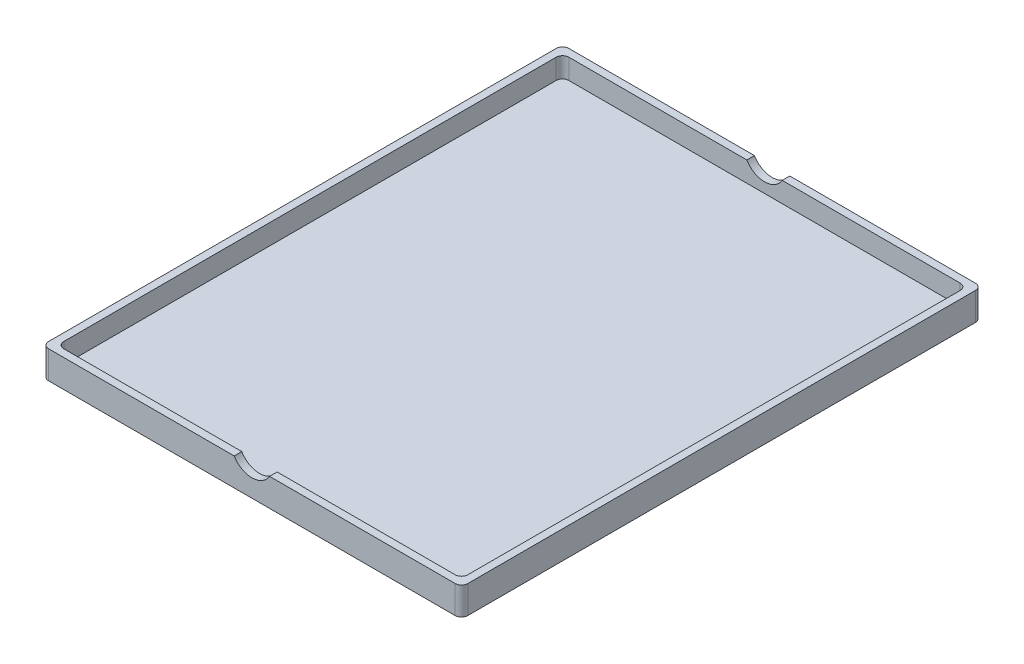
ISO-10303-21;
HEADER;
FILE_DESCRIPTION(('STEP AP214'),'2;1');
FILE_NAME('part.step','',(''),(''),'','','');
FILE_SCHEMA(('AUTOMOTIVE_DESIGN { 1 0 10303 214 1 1 1 1 }'));
ENDSEC;
DATA;
#1=APPLICATION_CONTEXT('core data for automotive mechanical design processes');
#2=APPLICATION_PROTOCOL_DEFINITION('international standard','automotive_design',2000,#1);
#3=PRODUCT_CONTEXT('',#1,'mechanical');
#4=PRODUCT('Part','Part','',(#3));
#5=PRODUCT_RELATED_PRODUCT_CATEGORY('part','',(#4));
#6=PRODUCT_DEFINITION_FORMATION('','',#4);
#7=PRODUCT_DEFINITION_CONTEXT('part definition',#1,'design');
#8=PRODUCT_DEFINITION('design','',#6,#7);
#9=PRODUCT_DEFINITION_SHAPE('','',#8);
#10=(LENGTH_UNIT() NAMED_UNIT(*) SI_UNIT(.MILLI.,.METRE.));
#11=(NAMED_UNIT(*) PLANE_ANGLE_UNIT() SI_UNIT($,.RADIAN.));
#12=(NAMED_UNIT(*) SI_UNIT($,.STERADIAN.) SOLID_ANGLE_UNIT());
#13=UNCERTAINTY_MEASURE_WITH_UNIT(LENGTH_MEASURE(1.E-05),#10,'distance_accuracy_value','');
#14=(GEOMETRIC_REPRESENTATION_CONTEXT(3) GLOBAL_UNCERTAINTY_ASSIGNED_CONTEXT((#13)) GLOBAL_UNIT_ASSIGNED_CONTEXT((#10,
#11,#12)) REPRESENTATION_CONTEXT('',''));
#15=CARTESIAN_POINT('',(0.,0.,0.));
#16=DIRECTION('',(0.,0.,1.));
#17=DIRECTION('',(1.,0.,0.));
#18=AXIS2_PLACEMENT_3D('',#15,#16,#17);
#19=CARTESIAN_POINT('',(0.,8.,0.));
#20=DIRECTION('',(0.,1.,0.));
#21=DIRECTION('',(0.,0.,1.));
#22=AXIS2_PLACEMENT_3D('',#19,#20,#21);
#23=PLANE('',#22);
#24=DIRECTION('',(0.,0.,1.));
#25=VECTOR('',#24,1.);
#26=CARTESIAN_POINT('',(-6.99999999999998,8.,-103.));
#27=LINE('',#26,#25);
#28=CARTESIAN_POINT('',(-6.99999999999998,8.,-103.));
#29=VERTEX_POINT('',#28);
#30=CARTESIAN_POINT('',(-6.99999999999998,8.,-100.));
#31=VERTEX_POINT('',#30);
#32=EDGE_CURVE('E55',#29,#31,#27,.T.);
#33=ORIENTED_EDGE('',*,*,#32,.F.);
#34=DIRECTION('',(-1.,0.,0.));
#35=VECTOR('',#34,1.);
#36=CARTESIAN_POINT('',(80.,8.,-103.));
#37=LINE('',#36,#35);
#38=CARTESIAN_POINT('',(-80.5,8.,-103.));
#39=VERTEX_POINT('',#38);
#40=EDGE_CURVE('E228',#29,#39,#37,.T.);
#41=ORIENTED_EDGE('',*,*,#40,.T.);
#42=CARTESIAN_POINT('',(-80.5,8.,-100.5));
#43=DIRECTION('',(0.,1.,0.));
#44=DIRECTION('',(0.,0.,1.));
#45=AXIS2_PLACEMENT_3D('',#42,#43,#44);
#46=CIRCLE('',#45,2.5);
#47=CARTESIAN_POINT('',(-83.,8.,-100.5));
#48=VERTEX_POINT('',#47);
#49=EDGE_CURVE('E297',#39,#48,#46,.T.);
#50=ORIENTED_EDGE('',*,*,#49,.T.);
#51=DIRECTION('',(0.,0.,1.));
#52=VECTOR('',#51,1.);
#53=CARTESIAN_POINT('',(-83.,8.,100.));
#54=LINE('',#53,#52);
#55=CARTESIAN_POINT('',(-83.,8.,100.5));
#56=VERTEX_POINT('',#55);
#57=EDGE_CURVE('E391',#48,#56,#54,.T.);
#58=ORIENTED_EDGE('',*,*,#57,.T.);
#59=CARTESIAN_POINT('',(-80.5,8.,100.5));
#60=DIRECTION('',(0.,1.,0.));
#61=DIRECTION('',(0.,0.,1.));
#62=AXIS2_PLACEMENT_3D('',#59,#60,#61);
#63=CIRCLE('',#62,2.5);
#64=CARTESIAN_POINT('',(-80.5,8.,103.));
#65=VERTEX_POINT('',#64);
#66=EDGE_CURVE('E291',#56,#65,#63,.T.);
#67=ORIENTED_EDGE('',*,*,#66,.T.);
#68=DIRECTION('',(1.,0.,0.));
#69=VECTOR('',#68,1.);
#70=CARTESIAN_POINT('',(80.,8.,103.));
#71=LINE('',#70,#69);
#72=CARTESIAN_POINT('',(-6.99999999999998,8.,103.));
#73=VERTEX_POINT('',#72);
#74=EDGE_CURVE('E243',#65,#73,#71,.T.);
#75=ORIENTED_EDGE('',*,*,#74,.T.);
#76=CARTESIAN_POINT('',(-6.99999999999998,8.,100.));
#77=VERTEX_POINT('',#76);
#78=EDGE_CURVE('E223',#77,#73,#27,.T.);
#79=ORIENTED_EDGE('',*,*,#78,.F.);
#80=DIRECTION('',(1.,0.,0.));
#81=VECTOR('',#80,1.);
#82=CARTESIAN_POINT('',(80.,8.,100.));
#83=LINE('',#82,#81);
#84=CARTESIAN_POINT('',(-77.5,8.,100.));
#85=VERTEX_POINT('',#84);
#86=EDGE_CURVE('E448',#85,#77,#83,.T.);
#87=ORIENTED_EDGE('',*,*,#86,.F.);
#88=CARTESIAN_POINT('',(-77.5,8.,97.5));
#89=DIRECTION('',(0.,1.,0.));
#90=DIRECTION('',(0.,0.,1.));
#91=AXIS2_PLACEMENT_3D('',#88,#89,#90);
#92=CIRCLE('',#91,2.5);
#93=CARTESIAN_POINT('',(-80.,8.,97.5));
#94=VERTEX_POINT('',#93);
#95=EDGE_CURVE('E349',#85,#94,#92,.F.);
#96=ORIENTED_EDGE('',*,*,#95,.T.);
#97=DIRECTION('',(0.,0.,1.));
#98=VECTOR('',#97,1.);
#99=CARTESIAN_POINT('',(-80.,8.,100.));
#100=LINE('',#99,#98);
#101=CARTESIAN_POINT('',(-80.,8.,-97.5));
#102=VERTEX_POINT('',#101);
#103=EDGE_CURVE('E356',#102,#94,#100,.T.);
#104=ORIENTED_EDGE('',*,*,#103,.F.);
#105=CARTESIAN_POINT('',(-77.5,8.,-97.5));
#106=DIRECTION('',(0.,1.,0.));
#107=DIRECTION('',(0.,0.,1.));
#108=AXIS2_PLACEMENT_3D('',#105,#106,#107);
#109=CIRCLE('',#108,2.5);
#110=CARTESIAN_POINT('',(-77.5,8.,-100.));
#111=VERTEX_POINT('',#110);
#112=EDGE_CURVE('E41',#102,#111,#109,.F.);
#113=ORIENTED_EDGE('',*,*,#112,.T.);
#114=DIRECTION('',(-1.,0.,0.));
#115=VECTOR('',#114,1.);
#116=CARTESIAN_POINT('',(80.,8.,-100.));
#117=LINE('',#116,#115);
#118=EDGE_CURVE('E231',#31,#111,#117,.T.);
#119=ORIENTED_EDGE('',*,*,#118,.F.);
#120=EDGE_LOOP('',(#33,#41,#50,#58,#67,#75,#79,#87,#96,#104,#113,#119));
#121=FACE_BOUND('',#120,.T.);
#122=ADVANCED_FACE('F33',(#121),#23,.T.);
#123=CARTESIAN_POINT('',(0.,-3.,0.));
#124=DIRECTION('',(0.,1.,0.));
#125=DIRECTION('',(0.,0.,1.));
#126=AXIS2_PLACEMENT_3D('',#123,#124,#125);
#127=PLANE('',#126);
#128=DIRECTION('',(0.,0.,1.));
#129=VECTOR('',#128,1.);
#130=CARTESIAN_POINT('',(-83.,-3.,100.));
#131=LINE('',#130,#129);
#132=CARTESIAN_POINT('',(-83.,-3.,-100.5));
#133=VERTEX_POINT('',#132);
#134=CARTESIAN_POINT('',(-83.,-3.,100.5));
#135=VERTEX_POINT('',#134);
#136=EDGE_CURVE('E379',#133,#135,#131,.T.);
#137=ORIENTED_EDGE('',*,*,#136,.F.);
#138=CARTESIAN_POINT('',(-80.5,-3.,-100.5));
#139=DIRECTION('',(0.,1.,0.));
#140=DIRECTION('',(0.,0.,1.));
#141=AXIS2_PLACEMENT_3D('',#138,#139,#140);
#142=CIRCLE('',#141,2.5);
#143=CARTESIAN_POINT('',(-80.5,-3.,-103.));
#144=VERTEX_POINT('',#143);
#145=EDGE_CURVE('E285',#133,#144,#142,.F.);
#146=ORIENTED_EDGE('',*,*,#145,.T.);
#147=DIRECTION('',(-1.,0.,0.));
#148=VECTOR('',#147,1.);
#149=CARTESIAN_POINT('',(80.,-3.,-103.));
#150=LINE('',#149,#148);
#151=CARTESIAN_POINT('',(80.5,-3.,-103.));
#152=VERTEX_POINT('',#151);
#153=EDGE_CURVE('E389',#152,#144,#150,.T.);
#154=ORIENTED_EDGE('',*,*,#153,.F.);
#155=CARTESIAN_POINT('',(80.5,-3.,-100.5));
#156=DIRECTION('',(0.,1.,0.));
#157=DIRECTION('',(0.,0.,1.));
#158=AXIS2_PLACEMENT_3D('',#155,#156,#157);
#159=CIRCLE('',#158,2.5);
#160=CARTESIAN_POINT('',(83.,-3.,-100.5));
#161=VERTEX_POINT('',#160);
#162=EDGE_CURVE('E283',#152,#161,#159,.F.);
#163=ORIENTED_EDGE('',*,*,#162,.T.);
#164=DIRECTION('',(0.,0.,-1.));
#165=VECTOR('',#164,1.);
#166=CARTESIAN_POINT('',(83.,-3.,100.));
#167=LINE('',#166,#165);
#168=CARTESIAN_POINT('',(83.,-3.,100.5));
#169=VERTEX_POINT('',#168);
#170=EDGE_CURVE('E386',#169,#161,#167,.T.);
#171=ORIENTED_EDGE('',*,*,#170,.F.);
#172=CARTESIAN_POINT('',(80.5,-3.,100.5));
#173=DIRECTION('',(0.,1.,0.));
#174=DIRECTION('',(0.,0.,1.));
#175=AXIS2_PLACEMENT_3D('',#172,#173,#174);
#176=CIRCLE('',#175,2.5);
#177=CARTESIAN_POINT('',(80.5,-3.,103.));
#178=VERTEX_POINT('',#177);
#179=EDGE_CURVE('E281',#169,#178,#176,.F.);
#180=ORIENTED_EDGE('',*,*,#179,.T.);
#181=DIRECTION('',(1.,0.,0.));
#182=VECTOR('',#181,1.);
#183=CARTESIAN_POINT('',(80.,-3.,103.));
#184=LINE('',#183,#182);
#185=CARTESIAN_POINT('',(-80.5,-3.,103.));
#186=VERTEX_POINT('',#185);
#187=EDGE_CURVE('E382',#186,#178,#184,.T.);
#188=ORIENTED_EDGE('',*,*,#187,.F.);
#189=CARTESIAN_POINT('',(-80.5,-3.,100.5));
#190=DIRECTION('',(0.,1.,0.));
#191=DIRECTION('',(0.,0.,1.));
#192=AXIS2_PLACEMENT_3D('',#189,#190,#191);
#193=CIRCLE('',#192,2.5);
#194=EDGE_CURVE('E279',#186,#135,#193,.F.);
#195=ORIENTED_EDGE('',*,*,#194,.T.);
#196=EDGE_LOOP('',(#137,#146,#154,#163,#171,#180,#188,#195));
#197=FACE_BOUND('',#196,.T.);
#198=DIRECTION('',(0.,0.,-1.));
#199=VECTOR('',#198,1.);
#200=CARTESIAN_POINT('',(-80.,-3.,-100.));
#201=LINE('',#200,#199);
#202=CARTESIAN_POINT('',(-80.,-3.,97.5));
#203=VERTEX_POINT('',#202);
#204=CARTESIAN_POINT('',(-80.,-3.,-97.5));
#205=VERTEX_POINT('',#204);
#206=EDGE_CURVE('E533',#203,#205,#201,.T.);
#207=ORIENTED_EDGE('',*,*,#206,.F.);
#208=CARTESIAN_POINT('',(-77.5,-3.,97.5));
#209=DIRECTION('',(0.,1.,0.));
#210=DIRECTION('',(0.,0.,1.));
#211=AXIS2_PLACEMENT_3D('',#208,#209,#210);
#212=CIRCLE('',#211,2.5);
#213=CARTESIAN_POINT('',(-77.5,-3.,100.));
#214=VERTEX_POINT('',#213);
#215=EDGE_CURVE('E344',#203,#214,#212,.T.);
#216=ORIENTED_EDGE('',*,*,#215,.T.);
#217=DIRECTION('',(-1.,0.,0.));
#218=VECTOR('',#217,1.);
#219=CARTESIAN_POINT('',(80.,-3.,100.));
#220=LINE('',#219,#218);
#221=CARTESIAN_POINT('',(77.5,-3.,100.));
#222=VERTEX_POINT('',#221);
#223=EDGE_CURVE('E523',#222,#214,#220,.T.);
#224=ORIENTED_EDGE('',*,*,#223,.F.);
#225=CARTESIAN_POINT('',(77.5,-3.,97.5));
#226=DIRECTION('',(0.,1.,0.));
#227=DIRECTION('',(0.,0.,1.));
#228=AXIS2_PLACEMENT_3D('',#225,#226,#227);
#229=CIRCLE('',#228,2.5);
#230=CARTESIAN_POINT('',(80.,-3.,97.5));
#231=VERTEX_POINT('',#230);
#232=EDGE_CURVE('E342',#222,#231,#229,.T.);
#233=ORIENTED_EDGE('',*,*,#232,.T.);
#234=DIRECTION('',(0.,0.,1.));
#235=VECTOR('',#234,1.);
#236=CARTESIAN_POINT('',(80.,-3.,-100.));
#237=LINE('',#236,#235);
#238=CARTESIAN_POINT('',(80.,-3.,-97.5));
#239=VERTEX_POINT('',#238);
#240=EDGE_CURVE('E527',#239,#231,#237,.T.);
#241=ORIENTED_EDGE('',*,*,#240,.F.);
#242=CARTESIAN_POINT('',(77.5,-3.,-97.5));
#243=DIRECTION('',(0.,1.,0.));
#244=DIRECTION('',(0.,0.,1.));
#245=AXIS2_PLACEMENT_3D('',#242,#243,#244);
#246=CIRCLE('',#245,2.5);
#247=CARTESIAN_POINT('',(77.5,-3.,-100.));
#248=VERTEX_POINT('',#247);
#249=EDGE_CURVE('E340',#239,#248,#246,.T.);
#250=ORIENTED_EDGE('',*,*,#249,.T.);
#251=DIRECTION('',(1.,0.,0.));
#252=VECTOR('',#251,1.);
#253=CARTESIAN_POINT('',(80.,-3.,-100.));
#254=LINE('',#253,#252);
#255=CARTESIAN_POINT('',(-77.5,-3.,-100.));
#256=VERTEX_POINT('',#255);
#257=EDGE_CURVE('E530',#256,#248,#254,.T.);
#258=ORIENTED_EDGE('',*,*,#257,.F.);
#259=CARTESIAN_POINT('',(-77.5,-3.,-97.5));
#260=DIRECTION('',(0.,1.,0.));
#261=DIRECTION('',(0.,0.,1.));
#262=AXIS2_PLACEMENT_3D('',#259,#260,#261);
#263=CIRCLE('',#262,2.5);
#264=EDGE_CURVE('E338',#256,#205,#263,.T.);
#265=ORIENTED_EDGE('',*,*,#264,.T.);
#266=EDGE_LOOP('',(#207,#216,#224,#233,#241,#250,#258,#265));
#267=FACE_BOUND('',#266,.T.);
#268=ADVANCED_FACE('F417',(#197,#267),#127,.F.);
#269=CARTESIAN_POINT('',(-83.,8.,100.));
#270=DIRECTION('',(1.,0.,0.));
#271=DIRECTION('',(0.,0.,-1.));
#272=AXIS2_PLACEMENT_3D('',#269,#270,#271);
#273=PLANE('',#272);
#274=ORIENTED_EDGE('',*,*,#57,.F.);
#275=DIRECTION('',(0.,-1.,0.));
#276=VECTOR('',#275,1.);
#277=CARTESIAN_POINT('',(-83.,8.,-100.5));
#278=LINE('',#277,#276);
#279=EDGE_CURVE('E276',#48,#133,#278,.T.);
#280=ORIENTED_EDGE('',*,*,#279,.T.);
#281=ORIENTED_EDGE('',*,*,#136,.T.);
#282=DIRECTION('',(0.,-1.,0.));
#283=VECTOR('',#282,1.);
#284=CARTESIAN_POINT('',(-83.,8.,100.5));
#285=LINE('',#284,#283);
#286=EDGE_CURVE('E274',#135,#56,#285,.F.);
#287=ORIENTED_EDGE('',*,*,#286,.T.);
#288=EDGE_LOOP('',(#274,#280,#281,#287));
#289=FACE_BOUND('',#288,.T.);
#290=ADVANCED_FACE('F464',(#289),#273,.F.);
#291=CARTESIAN_POINT('',(80.,8.,103.));
#292=DIRECTION('',(0.,0.,-1.));
#293=DIRECTION('',(-1.,0.,0.));
#294=AXIS2_PLACEMENT_3D('',#291,#292,#293);
#295=PLANE('',#294);
#296=CARTESIAN_POINT('',(7.00000000000001,8.,103.));
#297=VERTEX_POINT('',#296);
#298=CARTESIAN_POINT('',(80.5,8.,103.));
#299=VERTEX_POINT('',#298);
#300=EDGE_CURVE('E393',#297,#299,#71,.T.);
#301=ORIENTED_EDGE('',*,*,#300,.F.);
#302=CARTESIAN_POINT('',(0.,12.125,103.));
#303=DIRECTION('',(0.,0.,1.));
#304=DIRECTION('',(1.,0.,0.));
#305=AXIS2_PLACEMENT_3D('',#302,#303,#304);
#306=CIRCLE('',#305,8.125);
#307=EDGE_CURVE('E224',#73,#297,#306,.T.);
#308=ORIENTED_EDGE('',*,*,#307,.F.);
#309=ORIENTED_EDGE('',*,*,#74,.F.);
#310=DIRECTION('',(0.,-1.,0.));
#311=VECTOR('',#310,1.);
#312=CARTESIAN_POINT('',(-80.5,8.,103.));
#313=LINE('',#312,#311);
#314=EDGE_CURVE('E304',#65,#186,#313,.T.);
#315=ORIENTED_EDGE('',*,*,#314,.T.);
#316=ORIENTED_EDGE('',*,*,#187,.T.);
#317=DIRECTION('',(0.,-1.,0.));
#318=VECTOR('',#317,1.);
#319=CARTESIAN_POINT('',(80.5,8.,103.));
#320=LINE('',#319,#318);
#321=EDGE_CURVE('E307',#178,#299,#320,.F.);
#322=ORIENTED_EDGE('',*,*,#321,.T.);
#323=EDGE_LOOP('',(#301,#308,#309,#315,#316,#322));
#324=FACE_BOUND('',#323,.T.);
#325=ADVANCED_FACE('F406',(#324),#295,.F.);
#326=CARTESIAN_POINT('',(83.,8.,100.));
#327=DIRECTION('',(-1.,0.,0.));
#328=DIRECTION('',(0.,0.,1.));
#329=AXIS2_PLACEMENT_3D('',#326,#327,#328);
#330=PLANE('',#329);
#331=ORIENTED_EDGE('',*,*,#170,.T.);
#332=DIRECTION('',(0.,-1.,0.));
#333=VECTOR('',#332,1.);
#334=CARTESIAN_POINT('',(83.,8.,-100.5));
#335=LINE('',#334,#333);
#336=CARTESIAN_POINT('',(83.,8.,-100.5));
#337=VERTEX_POINT('',#336);
#338=EDGE_CURVE('E302',#161,#337,#335,.F.);
#339=ORIENTED_EDGE('',*,*,#338,.T.);
#340=DIRECTION('',(0.,0.,-1.));
#341=VECTOR('',#340,1.);
#342=CARTESIAN_POINT('',(83.,8.,100.));
#343=LINE('',#342,#341);
#344=CARTESIAN_POINT('',(83.,8.,100.5));
#345=VERTEX_POINT('',#344);
#346=EDGE_CURVE('E239',#345,#337,#343,.T.);
#347=ORIENTED_EDGE('',*,*,#346,.F.);
#348=DIRECTION('',(0.,-1.,0.));
#349=VECTOR('',#348,1.);
#350=CARTESIAN_POINT('',(83.,8.,100.5));
#351=LINE('',#350,#349);
#352=EDGE_CURVE('E299',#345,#169,#351,.T.);
#353=ORIENTED_EDGE('',*,*,#352,.T.);
#354=EDGE_LOOP('',(#331,#339,#347,#353));
#355=FACE_BOUND('',#354,.T.);
#356=ADVANCED_FACE('F413',(#355),#330,.F.);
#357=CARTESIAN_POINT('',(80.,8.,-103.));
#358=DIRECTION('',(0.,0.,1.));
#359=DIRECTION('',(1.,0.,0.));
#360=AXIS2_PLACEMENT_3D('',#357,#358,#359);
#361=PLANE('',#360);
#362=ORIENTED_EDGE('',*,*,#40,.F.);
#363=CARTESIAN_POINT('',(0.,12.125,-103.));
#364=DIRECTION('',(0.,0.,1.));
#365=DIRECTION('',(1.,0.,0.));
#366=AXIS2_PLACEMENT_3D('',#363,#364,#365);
#367=CIRCLE('',#366,8.125);
#368=CARTESIAN_POINT('',(7.00000000000001,8.,-103.));
#369=VERTEX_POINT('',#368);
#370=EDGE_CURVE('E215',#29,#369,#367,.T.);
#371=ORIENTED_EDGE('',*,*,#370,.T.);
#372=CARTESIAN_POINT('',(80.5,8.,-103.));
#373=VERTEX_POINT('',#372);
#374=EDGE_CURVE('E238',#373,#369,#37,.T.);
#375=ORIENTED_EDGE('',*,*,#374,.F.);
#376=DIRECTION('',(0.,-1.,0.));
#377=VECTOR('',#376,1.);
#378=CARTESIAN_POINT('',(80.5,8.,-103.));
#379=LINE('',#378,#377);
#380=EDGE_CURVE('E287',#373,#152,#379,.T.);
#381=ORIENTED_EDGE('',*,*,#380,.T.);
#382=ORIENTED_EDGE('',*,*,#153,.T.);
#383=DIRECTION('',(0.,-1.,0.));
#384=VECTOR('',#383,1.);
#385=CARTESIAN_POINT('',(-80.5,8.,-103.));
#386=LINE('',#385,#384);
#387=EDGE_CURVE('E236',#144,#39,#386,.F.);
#388=ORIENTED_EDGE('',*,*,#387,.T.);
#389=EDGE_LOOP('',(#362,#371,#375,#381,#382,#388));
#390=FACE_BOUND('',#389,.T.);
#391=ADVANCED_FACE('F233',(#390),#361,.F.);
#392=DIRECTION('',(0.,0.,1.));
#393=VECTOR('',#392,1.);
#394=CARTESIAN_POINT('',(7.00000000000001,8.,-103.));
#395=LINE('',#394,#393);
#396=CARTESIAN_POINT('',(7.00000000000001,8.,100.));
#397=VERTEX_POINT('',#396);
#398=EDGE_CURVE('E48',#397,#297,#395,.T.);
#399=ORIENTED_EDGE('',*,*,#398,.T.);
#400=ORIENTED_EDGE('',*,*,#300,.T.);
#401=CARTESIAN_POINT('',(80.5,8.,100.5));
#402=DIRECTION('',(0.,1.,0.));
#403=DIRECTION('',(0.,0.,1.));
#404=AXIS2_PLACEMENT_3D('',#401,#402,#403);
#405=CIRCLE('',#404,2.5);
#406=EDGE_CURVE('E293',#299,#345,#405,.T.);
#407=ORIENTED_EDGE('',*,*,#406,.T.);
#408=ORIENTED_EDGE('',*,*,#346,.T.);
#409=CARTESIAN_POINT('',(80.5,8.,-100.5));
#410=DIRECTION('',(0.,1.,0.));
#411=DIRECTION('',(0.,0.,1.));
#412=AXIS2_PLACEMENT_3D('',#409,#410,#411);
#413=CIRCLE('',#412,2.5);
#414=EDGE_CURVE('E295',#337,#373,#413,.T.);
#415=ORIENTED_EDGE('',*,*,#414,.T.);
#416=ORIENTED_EDGE('',*,*,#374,.T.);
#417=CARTESIAN_POINT('',(7.00000000000001,8.,-100.));
#418=VERTEX_POINT('',#417);
#419=EDGE_CURVE('E218',#369,#418,#395,.T.);
#420=ORIENTED_EDGE('',*,*,#419,.T.);
#421=CARTESIAN_POINT('',(77.5,8.,-100.));
#422=VERTEX_POINT('',#421);
#423=EDGE_CURVE('E383',#422,#418,#117,.T.);
#424=ORIENTED_EDGE('',*,*,#423,.F.);
#425=CARTESIAN_POINT('',(77.5,8.,-97.5));
#426=DIRECTION('',(0.,1.,0.));
#427=DIRECTION('',(0.,0.,1.));
#428=AXIS2_PLACEMENT_3D('',#425,#426,#427);
#429=CIRCLE('',#428,2.5);
#430=CARTESIAN_POINT('',(80.,8.,-97.5));
#431=VERTEX_POINT('',#430);
#432=EDGE_CURVE('E351',#422,#431,#429,.F.);
#433=ORIENTED_EDGE('',*,*,#432,.T.);
#434=DIRECTION('',(0.,0.,-1.));
#435=VECTOR('',#434,1.);
#436=CARTESIAN_POINT('',(80.,8.,100.));
#437=LINE('',#436,#435);
#438=CARTESIAN_POINT('',(80.,8.,97.5));
#439=VERTEX_POINT('',#438);
#440=EDGE_CURVE('E430',#439,#431,#437,.T.);
#441=ORIENTED_EDGE('',*,*,#440,.F.);
#442=CARTESIAN_POINT('',(77.5,8.,97.5));
#443=DIRECTION('',(0.,1.,0.));
#444=DIRECTION('',(0.,0.,1.));
#445=AXIS2_PLACEMENT_3D('',#442,#443,#444);
#446=CIRCLE('',#445,2.5);
#447=CARTESIAN_POINT('',(77.5,8.,100.));
#448=VERTEX_POINT('',#447);
#449=EDGE_CURVE('E346',#439,#448,#446,.F.);
#450=ORIENTED_EDGE('',*,*,#449,.T.);
#451=EDGE_CURVE('E373',#397,#448,#83,.T.);
#452=ORIENTED_EDGE('',*,*,#451,.F.);
#453=EDGE_LOOP('',(#399,#400,#407,#408,#415,#416,#420,#424,#433,#441,#450,#452));
#454=FACE_BOUND('',#453,.T.);
#455=ADVANCED_FACE('F399',(#454),#23,.T.);
#456=CARTESIAN_POINT('',(-80.,8.,100.));
#457=DIRECTION('',(1.,0.,0.));
#458=DIRECTION('',(0.,0.,-1.));
#459=AXIS2_PLACEMENT_3D('',#456,#457,#458);
#460=PLANE('',#459);
#461=ORIENTED_EDGE('',*,*,#103,.T.);
#462=DIRECTION('',(0.,-1.,0.));
#463=VECTOR('',#462,1.);
#464=CARTESIAN_POINT('',(-80.,0.,97.5));
#465=LINE('',#464,#463);
#466=CARTESIAN_POINT('',(-80.,0.,97.5));
#467=VERTEX_POINT('',#466);
#468=EDGE_CURVE('E330',#94,#467,#465,.T.);
#469=ORIENTED_EDGE('',*,*,#468,.T.);
#470=DIRECTION('',(0.,0.,1.));
#471=VECTOR('',#470,1.);
#472=CARTESIAN_POINT('',(-80.,0.,100.));
#473=LINE('',#472,#471);
#474=CARTESIAN_POINT('',(-80.,0.,-97.5));
#475=VERTEX_POINT('',#474);
#476=EDGE_CURVE('E434',#475,#467,#473,.T.);
#477=ORIENTED_EDGE('',*,*,#476,.F.);
#478=DIRECTION('',(0.,-1.,0.));
#479=VECTOR('',#478,1.);
#480=CARTESIAN_POINT('',(-80.,8.,-97.5));
#481=LINE('',#480,#479);
#482=EDGE_CURVE('E328',#475,#102,#481,.F.);
#483=ORIENTED_EDGE('',*,*,#482,.T.);
#484=EDGE_LOOP('',(#461,#469,#477,#483));
#485=FACE_BOUND('',#484,.T.);
#486=ADVANCED_FACE('F450',(#485),#460,.T.);
#487=CARTESIAN_POINT('',(80.,8.,100.));
#488=DIRECTION('',(0.,0.,-1.));
#489=DIRECTION('',(-1.,0.,0.));
#490=AXIS2_PLACEMENT_3D('',#487,#488,#489);
#491=PLANE('',#490);
#492=CARTESIAN_POINT('',(0.,12.125,100.));
#493=DIRECTION('',(0.,0.,-1.));
#494=DIRECTION('',(-1.,0.,0.));
#495=AXIS2_PLACEMENT_3D('',#492,#493,#494);
#496=CIRCLE('',#495,8.125);
#497=EDGE_CURVE('E427',#397,#77,#496,.T.);
#498=ORIENTED_EDGE('',*,*,#497,.F.);
#499=ORIENTED_EDGE('',*,*,#451,.T.);
#500=DIRECTION('',(0.,-1.,0.));
#501=VECTOR('',#500,1.);
#502=CARTESIAN_POINT('',(77.5,0.,100.));
#503=LINE('',#502,#501);
#504=CARTESIAN_POINT('',(77.5,0.,100.));
#505=VERTEX_POINT('',#504);
#506=EDGE_CURVE('E312',#448,#505,#503,.T.);
#507=ORIENTED_EDGE('',*,*,#506,.T.);
#508=DIRECTION('',(1.,0.,0.));
#509=VECTOR('',#508,1.);
#510=CARTESIAN_POINT('',(80.,0.,100.));
#511=LINE('',#510,#509);
#512=CARTESIAN_POINT('',(-77.5,0.,100.));
#513=VERTEX_POINT('',#512);
#514=EDGE_CURVE('E375',#513,#505,#511,.T.);
#515=ORIENTED_EDGE('',*,*,#514,.F.);
#516=DIRECTION('',(0.,-1.,0.));
#517=VECTOR('',#516,1.);
#518=CARTESIAN_POINT('',(-77.5,8.,100.));
#519=LINE('',#518,#517);
#520=EDGE_CURVE('E310',#513,#85,#519,.F.);
#521=ORIENTED_EDGE('',*,*,#520,.T.);
#522=ORIENTED_EDGE('',*,*,#86,.T.);
#523=EDGE_LOOP('',(#498,#499,#507,#515,#521,#522));
#524=FACE_BOUND('',#523,.T.);
#525=ADVANCED_FACE('F440',(#524),#491,.T.);
#526=CARTESIAN_POINT('',(80.,8.,100.));
#527=DIRECTION('',(-1.,0.,0.));
#528=DIRECTION('',(0.,0.,1.));
#529=AXIS2_PLACEMENT_3D('',#526,#527,#528);
#530=PLANE('',#529);
#531=DIRECTION('',(0.,0.,-1.));
#532=VECTOR('',#531,1.);
#533=CARTESIAN_POINT('',(80.,0.,100.));
#534=LINE('',#533,#532);
#535=CARTESIAN_POINT('',(80.,0.,97.5));
#536=VERTEX_POINT('',#535);
#537=CARTESIAN_POINT('',(80.,0.,-97.5));
#538=VERTEX_POINT('',#537);
#539=EDGE_CURVE('E371',#536,#538,#534,.T.);
#540=ORIENTED_EDGE('',*,*,#539,.F.);
#541=DIRECTION('',(0.,-1.,0.));
#542=VECTOR('',#541,1.);
#543=CARTESIAN_POINT('',(80.,8.,97.5));
#544=LINE('',#543,#542);
#545=EDGE_CURVE('E326',#536,#439,#544,.F.);
#546=ORIENTED_EDGE('',*,*,#545,.T.);
#547=ORIENTED_EDGE('',*,*,#440,.T.);
#548=DIRECTION('',(0.,-1.,0.));
#549=VECTOR('',#548,1.);
#550=CARTESIAN_POINT('',(80.,0.,-97.5));
#551=LINE('',#550,#549);
#552=EDGE_CURVE('E323',#431,#538,#551,.T.);
#553=ORIENTED_EDGE('',*,*,#552,.T.);
#554=EDGE_LOOP('',(#540,#546,#547,#553));
#555=FACE_BOUND('',#554,.T.);
#556=ADVANCED_FACE('F457',(#555),#530,.T.);
#557=CARTESIAN_POINT('',(80.,8.,-100.));
#558=DIRECTION('',(0.,0.,1.));
#559=DIRECTION('',(1.,0.,0.));
#560=AXIS2_PLACEMENT_3D('',#557,#558,#559);
#561=PLANE('',#560);
#562=CARTESIAN_POINT('',(0.,12.125,-100.));
#563=DIRECTION('',(0.,0.,1.));
#564=DIRECTION('',(1.,0.,0.));
#565=AXIS2_PLACEMENT_3D('',#562,#563,#564);
#566=CIRCLE('',#565,8.125);
#567=EDGE_CURVE('E11',#31,#418,#566,.T.);
#568=ORIENTED_EDGE('',*,*,#567,.F.);
#569=ORIENTED_EDGE('',*,*,#118,.T.);
#570=DIRECTION('',(0.,-1.,0.));
#571=VECTOR('',#570,1.);
#572=CARTESIAN_POINT('',(-77.5,0.,-100.));
#573=LINE('',#572,#571);
#574=CARTESIAN_POINT('',(-77.5,0.,-100.));
#575=VERTEX_POINT('',#574);
#576=EDGE_CURVE('E333',#111,#575,#573,.T.);
#577=ORIENTED_EDGE('',*,*,#576,.T.);
#578=DIRECTION('',(-1.,0.,0.));
#579=VECTOR('',#578,1.);
#580=CARTESIAN_POINT('',(80.,0.,-100.));
#581=LINE('',#580,#579);
#582=CARTESIAN_POINT('',(77.5,0.,-100.));
#583=VERTEX_POINT('',#582);
#584=EDGE_CURVE('E363',#583,#575,#581,.T.);
#585=ORIENTED_EDGE('',*,*,#584,.F.);
#586=DIRECTION('',(0.,-1.,0.));
#587=VECTOR('',#586,1.);
#588=CARTESIAN_POINT('',(77.5,8.,-100.));
#589=LINE('',#588,#587);
#590=EDGE_CURVE('E336',#583,#422,#589,.F.);
#591=ORIENTED_EDGE('',*,*,#590,.T.);
#592=ORIENTED_EDGE('',*,*,#423,.T.);
#593=EDGE_LOOP('',(#568,#569,#577,#585,#591,#592));
#594=FACE_BOUND('',#593,.T.);
#595=ADVANCED_FACE('F362',(#594),#561,.T.);
#596=CARTESIAN_POINT('',(0.,0.,0.));
#597=DIRECTION('',(0.,1.,0.));
#598=DIRECTION('',(0.,0.,1.));
#599=AXIS2_PLACEMENT_3D('',#596,#597,#598);
#600=PLANE('',#599);
#601=ORIENTED_EDGE('',*,*,#514,.T.);
#602=CARTESIAN_POINT('',(77.5,0.,97.5));
#603=DIRECTION('',(0.,1.,0.));
#604=DIRECTION('',(0.,0.,1.));
#605=AXIS2_PLACEMENT_3D('',#602,#603,#604);
#606=CIRCLE('',#605,2.5);
#607=EDGE_CURVE('E321',#505,#536,#606,.T.);
#608=ORIENTED_EDGE('',*,*,#607,.T.);
#609=ORIENTED_EDGE('',*,*,#539,.T.);
#610=CARTESIAN_POINT('',(77.5,0.,-97.5));
#611=DIRECTION('',(0.,1.,0.));
#612=DIRECTION('',(0.,0.,1.));
#613=AXIS2_PLACEMENT_3D('',#610,#611,#612);
#614=CIRCLE('',#613,2.5);
#615=EDGE_CURVE('E317',#538,#583,#614,.T.);
#616=ORIENTED_EDGE('',*,*,#615,.T.);
#617=ORIENTED_EDGE('',*,*,#584,.T.);
#618=CARTESIAN_POINT('',(-77.5,0.,-97.5));
#619=DIRECTION('',(0.,1.,0.));
#620=DIRECTION('',(0.,0.,1.));
#621=AXIS2_PLACEMENT_3D('',#618,#619,#620);
#622=CIRCLE('',#621,2.5);
#623=EDGE_CURVE('E315',#575,#475,#622,.T.);
#624=ORIENTED_EDGE('',*,*,#623,.T.);
#625=ORIENTED_EDGE('',*,*,#476,.T.);
#626=CARTESIAN_POINT('',(-77.5,0.,97.5));
#627=DIRECTION('',(0.,1.,0.));
#628=DIRECTION('',(0.,0.,1.));
#629=AXIS2_PLACEMENT_3D('',#626,#627,#628);
#630=CIRCLE('',#629,2.5);
#631=EDGE_CURVE('E319',#467,#513,#630,.T.);
#632=ORIENTED_EDGE('',*,*,#631,.T.);
#633=EDGE_LOOP('',(#601,#608,#609,#616,#617,#624,#625,#632));
#634=FACE_BOUND('',#633,.T.);
#635=ADVANCED_FACE('F367',(#634),#600,.T.);
#636=CARTESIAN_POINT('',(-80.,-5.,-100.));
#637=DIRECTION('',(1.,0.,0.));
#638=DIRECTION('',(0.,0.,-1.));
#639=AXIS2_PLACEMENT_3D('',#636,#637,#638);
#640=PLANE('',#639);
#641=ORIENTED_EDGE('',*,*,#206,.T.);
#642=DIRECTION('',(0.,1.,0.));
#643=VECTOR('',#642,1.);
#644=CARTESIAN_POINT('',(-80.,-5.,-97.5));
#645=LINE('',#644,#643);
#646=CARTESIAN_POINT('',(-80.,-5.,-97.5));
#647=VERTEX_POINT('',#646);
#648=EDGE_CURVE('E254',#205,#647,#645,.F.);
#649=ORIENTED_EDGE('',*,*,#648,.T.);
#650=DIRECTION('',(0.,0.,-1.));
#651=VECTOR('',#650,1.);
#652=CARTESIAN_POINT('',(-80.,-5.,-100.));
#653=LINE('',#652,#651);
#654=CARTESIAN_POINT('',(-80.,-5.,97.5));
#655=VERTEX_POINT('',#654);
#656=EDGE_CURVE('E526',#655,#647,#653,.T.);
#657=ORIENTED_EDGE('',*,*,#656,.F.);
#658=DIRECTION('',(0.,1.,0.));
#659=VECTOR('',#658,1.);
#660=CARTESIAN_POINT('',(-80.,-5.,97.5));
#661=LINE('',#660,#659);
#662=EDGE_CURVE('E251',#655,#203,#661,.T.);
#663=ORIENTED_EDGE('',*,*,#662,.T.);
#664=EDGE_LOOP('',(#641,#649,#657,#663));
#665=FACE_BOUND('',#664,.T.);
#666=ADVANCED_FACE('F573',(#665),#640,.F.);
#667=CARTESIAN_POINT('',(80.,-5.,-100.));
#668=DIRECTION('',(0.,0.,1.));
#669=DIRECTION('',(1.,0.,0.));
#670=AXIS2_PLACEMENT_3D('',#667,#668,#669);
#671=PLANE('',#670);
#672=DIRECTION('',(1.,0.,0.));
#673=VECTOR('',#672,1.);
#674=CARTESIAN_POINT('',(80.,-5.,-100.));
#675=LINE('',#674,#673);
#676=CARTESIAN_POINT('',(-77.5,-5.,-100.));
#677=VERTEX_POINT('',#676);
#678=CARTESIAN_POINT('',(77.5,-5.,-100.));
#679=VERTEX_POINT('',#678);
#680=EDGE_CURVE('E541',#677,#679,#675,.T.);
#681=ORIENTED_EDGE('',*,*,#680,.F.);
#682=DIRECTION('',(0.,1.,0.));
#683=VECTOR('',#682,1.);
#684=CARTESIAN_POINT('',(-77.5,-5.,-100.));
#685=LINE('',#684,#683);
#686=EDGE_CURVE('E248',#677,#256,#685,.T.);
#687=ORIENTED_EDGE('',*,*,#686,.T.);
#688=ORIENTED_EDGE('',*,*,#257,.T.);
#689=DIRECTION('',(0.,1.,0.));
#690=VECTOR('',#689,1.);
#691=CARTESIAN_POINT('',(77.5,-5.,-100.));
#692=LINE('',#691,#690);
#693=EDGE_CURVE('E241',#248,#679,#692,.F.);
#694=ORIENTED_EDGE('',*,*,#693,.T.);
#695=EDGE_LOOP('',(#681,#687,#688,#694));
#696=FACE_BOUND('',#695,.T.);
#697=ADVANCED_FACE('F569',(#696),#671,.F.);
#698=CARTESIAN_POINT('',(80.,-5.,-100.));
#699=DIRECTION('',(-1.,0.,0.));
#700=DIRECTION('',(0.,0.,1.));
#701=AXIS2_PLACEMENT_3D('',#698,#699,#700);
#702=PLANE('',#701);
#703=DIRECTION('',(0.,0.,1.));
#704=VECTOR('',#703,1.);
#705=CARTESIAN_POINT('',(80.,-5.,-100.));
#706=LINE('',#705,#704);
#707=CARTESIAN_POINT('',(80.,-5.,-97.5));
#708=VERTEX_POINT('',#707);
#709=CARTESIAN_POINT('',(80.,-5.,97.5));
#710=VERTEX_POINT('',#709);
#711=EDGE_CURVE('E538',#708,#710,#706,.T.);
#712=ORIENTED_EDGE('',*,*,#711,.F.);
#713=DIRECTION('',(0.,1.,0.));
#714=VECTOR('',#713,1.);
#715=CARTESIAN_POINT('',(80.,-5.,-97.5));
#716=LINE('',#715,#714);
#717=EDGE_CURVE('E266',#708,#239,#716,.T.);
#718=ORIENTED_EDGE('',*,*,#717,.T.);
#719=ORIENTED_EDGE('',*,*,#240,.T.);
#720=DIRECTION('',(0.,1.,0.));
#721=VECTOR('',#720,1.);
#722=CARTESIAN_POINT('',(80.,-5.,97.5));
#723=LINE('',#722,#721);
#724=EDGE_CURVE('E264',#231,#710,#723,.F.);
#725=ORIENTED_EDGE('',*,*,#724,.T.);
#726=EDGE_LOOP('',(#712,#718,#719,#725));
#727=FACE_BOUND('',#726,.T.);
#728=ADVANCED_FACE('F565',(#727),#702,.F.);
#729=CARTESIAN_POINT('',(80.,-5.,100.));
#730=DIRECTION('',(0.,0.,-1.));
#731=DIRECTION('',(-1.,0.,0.));
#732=AXIS2_PLACEMENT_3D('',#729,#730,#731);
#733=PLANE('',#732);
#734=DIRECTION('',(-1.,0.,0.));
#735=VECTOR('',#734,1.);
#736=CARTESIAN_POINT('',(80.,-5.,100.));
#737=LINE('',#736,#735);
#738=CARTESIAN_POINT('',(77.5,-5.,100.));
#739=VERTEX_POINT('',#738);
#740=CARTESIAN_POINT('',(-77.5,-5.,100.));
#741=VERTEX_POINT('',#740);
#742=EDGE_CURVE('E435',#739,#741,#737,.T.);
#743=ORIENTED_EDGE('',*,*,#742,.F.);
#744=DIRECTION('',(0.,1.,0.));
#745=VECTOR('',#744,1.);
#746=CARTESIAN_POINT('',(77.5,-5.,100.));
#747=LINE('',#746,#745);
#748=EDGE_CURVE('E271',#739,#222,#747,.T.);
#749=ORIENTED_EDGE('',*,*,#748,.T.);
#750=ORIENTED_EDGE('',*,*,#223,.T.);
#751=DIRECTION('',(0.,1.,0.));
#752=VECTOR('',#751,1.);
#753=CARTESIAN_POINT('',(-77.5,-5.,100.));
#754=LINE('',#753,#752);
#755=EDGE_CURVE('E269',#214,#741,#754,.F.);
#756=ORIENTED_EDGE('',*,*,#755,.T.);
#757=EDGE_LOOP('',(#743,#749,#750,#756));
#758=FACE_BOUND('',#757,.T.);
#759=ADVANCED_FACE('F561',(#758),#733,.F.);
#760=CARTESIAN_POINT('',(0.,-5.,0.));
#761=DIRECTION('',(0.,-1.,0.));
#762=DIRECTION('',(0.,0.,-1.));
#763=AXIS2_PLACEMENT_3D('',#760,#761,#762);
#764=PLANE('',#763);
#765=ORIENTED_EDGE('',*,*,#656,.T.);
#766=CARTESIAN_POINT('',(-77.5,-5.,-97.5));
#767=DIRECTION('',(0.,-1.,0.));
#768=DIRECTION('',(0.,0.,-1.));
#769=AXIS2_PLACEMENT_3D('',#766,#767,#768);
#770=CIRCLE('',#769,2.5);
#771=EDGE_CURVE('E262',#647,#677,#770,.T.);
#772=ORIENTED_EDGE('',*,*,#771,.T.);
#773=ORIENTED_EDGE('',*,*,#680,.T.);
#774=CARTESIAN_POINT('',(77.5,-5.,-97.5));
#775=DIRECTION('',(0.,-1.,0.));
#776=DIRECTION('',(0.,0.,-1.));
#777=AXIS2_PLACEMENT_3D('',#774,#775,#776);
#778=CIRCLE('',#777,2.5);
#779=EDGE_CURVE('E260',#679,#708,#778,.T.);
#780=ORIENTED_EDGE('',*,*,#779,.T.);
#781=ORIENTED_EDGE('',*,*,#711,.T.);
#782=CARTESIAN_POINT('',(77.5,-5.,97.5));
#783=DIRECTION('',(0.,-1.,0.));
#784=DIRECTION('',(0.,0.,-1.));
#785=AXIS2_PLACEMENT_3D('',#782,#783,#784);
#786=CIRCLE('',#785,2.5);
#787=EDGE_CURVE('E258',#710,#739,#786,.T.);
#788=ORIENTED_EDGE('',*,*,#787,.T.);
#789=ORIENTED_EDGE('',*,*,#742,.T.);
#790=CARTESIAN_POINT('',(-77.5,-5.,97.5));
#791=DIRECTION('',(0.,-1.,0.));
#792=DIRECTION('',(0.,0.,-1.));
#793=AXIS2_PLACEMENT_3D('',#790,#791,#792);
#794=CIRCLE('',#793,2.5);
#795=EDGE_CURVE('E256',#741,#655,#794,.T.);
#796=ORIENTED_EDGE('',*,*,#795,.T.);
#797=EDGE_LOOP('',(#765,#772,#773,#780,#781,#788,#789,#796));
#798=FACE_BOUND('',#797,.T.);
#799=ADVANCED_FACE('F480',(#798),#764,.T.);
#800=CARTESIAN_POINT('',(-77.5,-5.,-97.5));
#801=DIRECTION('',(0.,1.,0.));
#802=DIRECTION('',(0.,0.,1.));
#803=AXIS2_PLACEMENT_3D('',#800,#801,#802);
#804=CYLINDRICAL_SURFACE('',#803,2.5);
#805=ORIENTED_EDGE('',*,*,#771,.F.);
#806=ORIENTED_EDGE('',*,*,#648,.F.);
#807=ORIENTED_EDGE('',*,*,#264,.F.);
#808=ORIENTED_EDGE('',*,*,#686,.F.);
#809=EDGE_LOOP('',(#805,#806,#807,#808));
#810=FACE_BOUND('',#809,.T.);
#811=ADVANCED_FACE('F476',(#810),#804,.T.);
#812=CARTESIAN_POINT('',(77.5,-5.,-97.5));
#813=DIRECTION('',(0.,1.,0.));
#814=DIRECTION('',(0.,0.,1.));
#815=AXIS2_PLACEMENT_3D('',#812,#813,#814);
#816=CYLINDRICAL_SURFACE('',#815,2.5);
#817=ORIENTED_EDGE('',*,*,#779,.F.);
#818=ORIENTED_EDGE('',*,*,#693,.F.);
#819=ORIENTED_EDGE('',*,*,#249,.F.);
#820=ORIENTED_EDGE('',*,*,#717,.F.);
#821=EDGE_LOOP('',(#817,#818,#819,#820));
#822=FACE_BOUND('',#821,.T.);
#823=ADVANCED_FACE('F479',(#822),#816,.T.);
#824=CARTESIAN_POINT('',(77.5,-5.,97.5));
#825=DIRECTION('',(0.,1.,0.));
#826=DIRECTION('',(0.,0.,1.));
#827=AXIS2_PLACEMENT_3D('',#824,#825,#826);
#828=CYLINDRICAL_SURFACE('',#827,2.5);
#829=ORIENTED_EDGE('',*,*,#787,.F.);
#830=ORIENTED_EDGE('',*,*,#724,.F.);
#831=ORIENTED_EDGE('',*,*,#232,.F.);
#832=ORIENTED_EDGE('',*,*,#748,.F.);
#833=EDGE_LOOP('',(#829,#830,#831,#832));
#834=FACE_BOUND('',#833,.T.);
#835=ADVANCED_FACE('F484',(#834),#828,.T.);
#836=CARTESIAN_POINT('',(-77.5,-5.,97.5));
#837=DIRECTION('',(0.,1.,0.));
#838=DIRECTION('',(0.,0.,1.));
#839=AXIS2_PLACEMENT_3D('',#836,#837,#838);
#840=CYLINDRICAL_SURFACE('',#839,2.5);
#841=ORIENTED_EDGE('',*,*,#795,.F.);
#842=ORIENTED_EDGE('',*,*,#755,.F.);
#843=ORIENTED_EDGE('',*,*,#215,.F.);
#844=ORIENTED_EDGE('',*,*,#662,.F.);
#845=EDGE_LOOP('',(#841,#842,#843,#844));
#846=FACE_BOUND('',#845,.T.);
#847=ADVANCED_FACE('F488',(#846),#840,.T.);
#848=CARTESIAN_POINT('',(-80.5,8.,-100.5));
#849=DIRECTION('',(0.,-1.,0.));
#850=DIRECTION('',(0.,0.,-1.));
#851=AXIS2_PLACEMENT_3D('',#848,#849,#850);
#852=CYLINDRICAL_SURFACE('',#851,2.5);
#853=ORIENTED_EDGE('',*,*,#49,.F.);
#854=ORIENTED_EDGE('',*,*,#387,.F.);
#855=ORIENTED_EDGE('',*,*,#145,.F.);
#856=ORIENTED_EDGE('',*,*,#279,.F.);
#857=EDGE_LOOP('',(#853,#854,#855,#856));
#858=FACE_BOUND('',#857,.T.);
#859=ADVANCED_FACE('F492',(#858),#852,.T.);
#860=CARTESIAN_POINT('',(80.5,8.,-100.5));
#861=DIRECTION('',(0.,-1.,0.));
#862=DIRECTION('',(0.,0.,-1.));
#863=AXIS2_PLACEMENT_3D('',#860,#861,#862);
#864=CYLINDRICAL_SURFACE('',#863,2.5);
#865=ORIENTED_EDGE('',*,*,#414,.F.);
#866=ORIENTED_EDGE('',*,*,#338,.F.);
#867=ORIENTED_EDGE('',*,*,#162,.F.);
#868=ORIENTED_EDGE('',*,*,#380,.F.);
#869=EDGE_LOOP('',(#865,#866,#867,#868));
#870=FACE_BOUND('',#869,.T.);
#871=ADVANCED_FACE('F423',(#870),#864,.T.);
#872=CARTESIAN_POINT('',(80.5,8.,100.5));
#873=DIRECTION('',(0.,-1.,0.));
#874=DIRECTION('',(0.,0.,-1.));
#875=AXIS2_PLACEMENT_3D('',#872,#873,#874);
#876=CYLINDRICAL_SURFACE('',#875,2.5);
#877=ORIENTED_EDGE('',*,*,#406,.F.);
#878=ORIENTED_EDGE('',*,*,#321,.F.);
#879=ORIENTED_EDGE('',*,*,#179,.F.);
#880=ORIENTED_EDGE('',*,*,#352,.F.);
#881=EDGE_LOOP('',(#877,#878,#879,#880));
#882=FACE_BOUND('',#881,.T.);
#883=ADVANCED_FACE('F410',(#882),#876,.T.);
#884=CARTESIAN_POINT('',(-80.5,8.,100.5));
#885=DIRECTION('',(0.,-1.,0.));
#886=DIRECTION('',(0.,0.,-1.));
#887=AXIS2_PLACEMENT_3D('',#884,#885,#886);
#888=CYLINDRICAL_SURFACE('',#887,2.5);
#889=ORIENTED_EDGE('',*,*,#66,.F.);
#890=ORIENTED_EDGE('',*,*,#286,.F.);
#891=ORIENTED_EDGE('',*,*,#194,.F.);
#892=ORIENTED_EDGE('',*,*,#314,.F.);
#893=EDGE_LOOP('',(#889,#890,#891,#892));
#894=FACE_BOUND('',#893,.T.);
#895=ADVANCED_FACE('F501',(#894),#888,.T.);
#896=CARTESIAN_POINT('',(77.5,8.,97.5));
#897=DIRECTION('',(0.,1.,0.));
#898=DIRECTION('',(0.,0.,1.));
#899=AXIS2_PLACEMENT_3D('',#896,#897,#898);
#900=CYLINDRICAL_SURFACE('',#899,2.5);
#901=ORIENTED_EDGE('',*,*,#449,.F.);
#902=ORIENTED_EDGE('',*,*,#545,.F.);
#903=ORIENTED_EDGE('',*,*,#607,.F.);
#904=ORIENTED_EDGE('',*,*,#506,.F.);
#905=EDGE_LOOP('',(#901,#902,#903,#904));
#906=FACE_BOUND('',#905,.T.);
#907=ADVANCED_FACE('F504',(#906),#900,.F.);
#908=CARTESIAN_POINT('',(-77.5,8.,97.5));
#909=DIRECTION('',(0.,1.,0.));
#910=DIRECTION('',(0.,0.,1.));
#911=AXIS2_PLACEMENT_3D('',#908,#909,#910);
#912=CYLINDRICAL_SURFACE('',#911,2.5);
#913=ORIENTED_EDGE('',*,*,#95,.F.);
#914=ORIENTED_EDGE('',*,*,#520,.F.);
#915=ORIENTED_EDGE('',*,*,#631,.F.);
#916=ORIENTED_EDGE('',*,*,#468,.F.);
#917=EDGE_LOOP('',(#913,#914,#915,#916));
#918=FACE_BOUND('',#917,.T.);
#919=ADVANCED_FACE('F446',(#918),#912,.F.);
#920=CARTESIAN_POINT('',(77.5,8.,-97.5));
#921=DIRECTION('',(0.,1.,0.));
#922=DIRECTION('',(0.,0.,1.));
#923=AXIS2_PLACEMENT_3D('',#920,#921,#922);
#924=CYLINDRICAL_SURFACE('',#923,2.5);
#925=ORIENTED_EDGE('',*,*,#432,.F.);
#926=ORIENTED_EDGE('',*,*,#590,.F.);
#927=ORIENTED_EDGE('',*,*,#615,.F.);
#928=ORIENTED_EDGE('',*,*,#552,.F.);
#929=EDGE_LOOP('',(#925,#926,#927,#928));
#930=FACE_BOUND('',#929,.T.);
#931=ADVANCED_FACE('F510',(#930),#924,.F.);
#932=CARTESIAN_POINT('',(-77.5,8.,-97.5));
#933=DIRECTION('',(0.,1.,0.));
#934=DIRECTION('',(0.,0.,1.));
#935=AXIS2_PLACEMENT_3D('',#932,#933,#934);
#936=CYLINDRICAL_SURFACE('',#935,2.5);
#937=ORIENTED_EDGE('',*,*,#112,.F.);
#938=ORIENTED_EDGE('',*,*,#482,.F.);
#939=ORIENTED_EDGE('',*,*,#623,.F.);
#940=ORIENTED_EDGE('',*,*,#576,.F.);
#941=EDGE_LOOP('',(#937,#938,#939,#940));
#942=FACE_BOUND('',#941,.T.);
#943=ADVANCED_FACE('F35',(#942),#936,.F.);
#944=CARTESIAN_POINT('',(0.,12.125,-103.));
#945=DIRECTION('',(0.,0.,1.));
#946=DIRECTION('',(1.,0.,0.));
#947=AXIS2_PLACEMENT_3D('',#944,#945,#946);
#948=CYLINDRICAL_SURFACE('',#947,8.125);
#949=ORIENTED_EDGE('',*,*,#567,.T.);
#950=ORIENTED_EDGE('',*,*,#419,.F.);
#951=ORIENTED_EDGE('',*,*,#370,.F.);
#952=ORIENTED_EDGE('',*,*,#32,.T.);
#953=EDGE_LOOP('',(#949,#950,#951,#952));
#954=FACE_BOUND('',#953,.T.);
#955=ADVANCED_FACE('F216',(#954),#948,.F.);
#956=ORIENTED_EDGE('',*,*,#497,.T.);
#957=ORIENTED_EDGE('',*,*,#78,.T.);
#958=ORIENTED_EDGE('',*,*,#307,.T.);
#959=ORIENTED_EDGE('',*,*,#398,.F.);
#960=EDGE_LOOP('',(#956,#957,#958,#959));
#961=FACE_BOUND('',#960,.T.);
#962=ADVANCED_FACE('F547',(#961),#948,.F.);
#963=CLOSED_SHELL('',(#122,#268,#290,#325,#356,#391,#455,#486,#525,#556,#595,#635,#666,#697,
#728,#759,#799,#811,#823,#835,#847,#859,#871,#883,#895,#907,#919,#931,#943,#955,#962));
#964=MANIFOLD_SOLID_BREP('B2',#963);
#965=ADVANCED_BREP_SHAPE_REPRESENTATION('',(#18,#964),#14);
#966=SHAPE_DEFINITION_REPRESENTATION(#9,#965);
ENDSEC;
END-ISO-10303-21;
